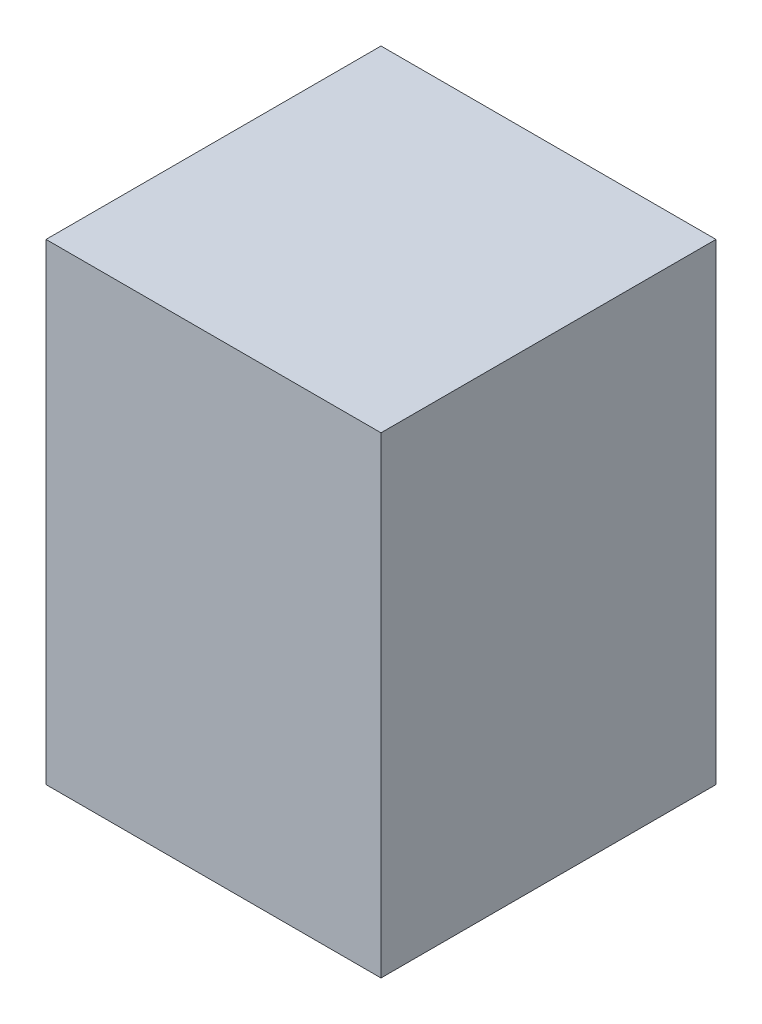
ISO-10303-21;
HEADER;
FILE_DESCRIPTION(('STEP AP214'),'2;1');
FILE_NAME('part.step','',(''),(''),'','','');
FILE_SCHEMA(('AUTOMOTIVE_DESIGN { 1 0 10303 214 1 1 1 1 }'));
ENDSEC;
DATA;
#1=APPLICATION_CONTEXT('core data for automotive mechanical design processes');
#2=APPLICATION_PROTOCOL_DEFINITION('international standard','automotive_design',2000,#1);
#3=PRODUCT_CONTEXT('',#1,'mechanical');
#4=PRODUCT('Part','Part','',(#3));
#5=PRODUCT_RELATED_PRODUCT_CATEGORY('part','',(#4));
#6=PRODUCT_DEFINITION_FORMATION('','',#4);
#7=PRODUCT_DEFINITION_CONTEXT('part definition',#1,'design');
#8=PRODUCT_DEFINITION('design','',#6,#7);
#9=PRODUCT_DEFINITION_SHAPE('','',#8);
#10=(LENGTH_UNIT() NAMED_UNIT(*) SI_UNIT(.MILLI.,.METRE.));
#11=(NAMED_UNIT(*) PLANE_ANGLE_UNIT() SI_UNIT($,.RADIAN.));
#12=(NAMED_UNIT(*) SI_UNIT($,.STERADIAN.) SOLID_ANGLE_UNIT());
#13=UNCERTAINTY_MEASURE_WITH_UNIT(LENGTH_MEASURE(1.E-05),#10,'distance_accuracy_value','');
#14=(GEOMETRIC_REPRESENTATION_CONTEXT(3) GLOBAL_UNCERTAINTY_ASSIGNED_CONTEXT((#13)) GLOBAL_UNIT_ASSIGNED_CONTEXT((#10,
#11,#12)) REPRESENTATION_CONTEXT('',''));
#15=CARTESIAN_POINT('',(0.,0.,0.));
#16=DIRECTION('',(0.,0.,1.));
#17=DIRECTION('',(1.,0.,0.));
#18=AXIS2_PLACEMENT_3D('',#15,#16,#17);
#19=CARTESIAN_POINT('',(0.,14.8,0.));
#20=DIRECTION('',(1.,0.,0.));
#21=DIRECTION('',(0.,0.,-1.));
#22=AXIS2_PLACEMENT_3D('',#19,#20,#21);
#23=PLANE('',#22);
#24=DIRECTION('',(0.,0.,1.));
#25=VECTOR('',#24,1.);
#26=CARTESIAN_POINT('',(0.,0.,0.));
#27=LINE('',#26,#25);
#28=CARTESIAN_POINT('',(0.,0.,-10.5));
#29=VERTEX_POINT('',#28);
#30=CARTESIAN_POINT('',(0.,0.,0.));
#31=VERTEX_POINT('',#30);
#32=EDGE_CURVE('E94',#29,#31,#27,.T.);
#33=ORIENTED_EDGE('',*,*,#32,.T.);
#34=DIRECTION('',(0.,-1.,0.));
#35=VECTOR('',#34,1.);
#36=CARTESIAN_POINT('',(0.,14.8,0.));
#37=LINE('',#36,#35);
#38=CARTESIAN_POINT('',(0.,14.8,0.));
#39=VERTEX_POINT('',#38);
#40=EDGE_CURVE('E11',#39,#31,#37,.T.);
#41=ORIENTED_EDGE('',*,*,#40,.F.);
#42=DIRECTION('',(0.,0.,1.));
#43=VECTOR('',#42,1.);
#44=CARTESIAN_POINT('',(0.,14.8,0.));
#45=LINE('',#44,#43);
#46=CARTESIAN_POINT('',(0.,14.8,-10.5));
#47=VERTEX_POINT('',#46);
#48=EDGE_CURVE('E82',#47,#39,#45,.T.);
#49=ORIENTED_EDGE('',*,*,#48,.F.);
#50=DIRECTION('',(0.,-1.,0.));
#51=VECTOR('',#50,1.);
#52=CARTESIAN_POINT('',(0.,14.8,-10.5));
#53=LINE('',#52,#51);
#54=EDGE_CURVE('E90',#47,#29,#53,.T.);
#55=ORIENTED_EDGE('',*,*,#54,.T.);
#56=EDGE_LOOP('',(#33,#41,#49,#55));
#57=FACE_BOUND('',#56,.T.);
#58=ADVANCED_FACE('F31',(#57),#23,.F.);
#59=CARTESIAN_POINT('',(0.,14.8,0.));
#60=DIRECTION('',(0.,0.,-1.));
#61=DIRECTION('',(-1.,0.,0.));
#62=AXIS2_PLACEMENT_3D('',#59,#60,#61);
#63=PLANE('',#62);
#64=DIRECTION('',(1.,0.,0.));
#65=VECTOR('',#64,1.);
#66=CARTESIAN_POINT('',(0.,0.,0.));
#67=LINE('',#66,#65);
#68=CARTESIAN_POINT('',(10.5,0.,0.));
#69=VERTEX_POINT('',#68);
#70=EDGE_CURVE('E86',#31,#69,#67,.T.);
#71=ORIENTED_EDGE('',*,*,#70,.T.);
#72=DIRECTION('',(0.,-1.,0.));
#73=VECTOR('',#72,1.);
#74=CARTESIAN_POINT('',(10.5,14.8,0.));
#75=LINE('',#74,#73);
#76=CARTESIAN_POINT('',(10.5,14.8,0.));
#77=VERTEX_POINT('',#76);
#78=EDGE_CURVE('E39',#77,#69,#75,.T.);
#79=ORIENTED_EDGE('',*,*,#78,.F.);
#80=DIRECTION('',(1.,0.,0.));
#81=VECTOR('',#80,1.);
#82=CARTESIAN_POINT('',(0.,14.8,0.));
#83=LINE('',#82,#81);
#84=EDGE_CURVE('E77',#39,#77,#83,.T.);
#85=ORIENTED_EDGE('',*,*,#84,.F.);
#86=ORIENTED_EDGE('',*,*,#40,.T.);
#87=EDGE_LOOP('',(#71,#79,#85,#86));
#88=FACE_BOUND('',#87,.T.);
#89=ADVANCED_FACE('F85',(#88),#63,.F.);
#90=CARTESIAN_POINT('',(10.5,14.8,0.));
#91=DIRECTION('',(-1.,0.,0.));
#92=DIRECTION('',(0.,0.,1.));
#93=AXIS2_PLACEMENT_3D('',#90,#91,#92);
#94=PLANE('',#93);
#95=DIRECTION('',(0.,0.,-1.));
#96=VECTOR('',#95,1.);
#97=CARTESIAN_POINT('',(10.5,0.,0.));
#98=LINE('',#97,#96);
#99=CARTESIAN_POINT('',(10.5,0.,-10.5));
#100=VERTEX_POINT('',#99);
#101=EDGE_CURVE('E64',#69,#100,#98,.T.);
#102=ORIENTED_EDGE('',*,*,#101,.T.);
#103=DIRECTION('',(0.,-1.,0.));
#104=VECTOR('',#103,1.);
#105=CARTESIAN_POINT('',(10.5,14.8,-10.5));
#106=LINE('',#105,#104);
#107=CARTESIAN_POINT('',(10.5,14.8,-10.5));
#108=VERTEX_POINT('',#107);
#109=EDGE_CURVE('E87',#108,#100,#106,.T.);
#110=ORIENTED_EDGE('',*,*,#109,.F.);
#111=DIRECTION('',(0.,0.,-1.));
#112=VECTOR('',#111,1.);
#113=CARTESIAN_POINT('',(10.5,14.8,0.));
#114=LINE('',#113,#112);
#115=EDGE_CURVE('E80',#77,#108,#114,.T.);
#116=ORIENTED_EDGE('',*,*,#115,.F.);
#117=ORIENTED_EDGE('',*,*,#78,.T.);
#118=EDGE_LOOP('',(#102,#110,#116,#117));
#119=FACE_BOUND('',#118,.T.);
#120=ADVANCED_FACE('F88',(#119),#94,.F.);
#121=CARTESIAN_POINT('',(0.,14.8,-10.5));
#122=DIRECTION('',(0.,0.,1.));
#123=DIRECTION('',(1.,0.,0.));
#124=AXIS2_PLACEMENT_3D('',#121,#122,#123);
#125=PLANE('',#124);
#126=DIRECTION('',(-1.,0.,0.));
#127=VECTOR('',#126,1.);
#128=CARTESIAN_POINT('',(0.,0.,-10.5));
#129=LINE('',#128,#127);
#130=EDGE_CURVE('E70',#100,#29,#129,.T.);
#131=ORIENTED_EDGE('',*,*,#130,.T.);
#132=ORIENTED_EDGE('',*,*,#54,.F.);
#133=DIRECTION('',(-1.,0.,0.));
#134=VECTOR('',#133,1.);
#135=CARTESIAN_POINT('',(0.,14.8,-10.5));
#136=LINE('',#135,#134);
#137=EDGE_CURVE('E47',#108,#47,#136,.T.);
#138=ORIENTED_EDGE('',*,*,#137,.F.);
#139=ORIENTED_EDGE('',*,*,#109,.T.);
#140=EDGE_LOOP('',(#131,#132,#138,#139));
#141=FACE_BOUND('',#140,.T.);
#142=ADVANCED_FACE('F101',(#141),#125,.F.);
#143=CARTESIAN_POINT('',(0.,14.8,-10.5));
#144=DIRECTION('',(0.,-1.,0.));
#145=DIRECTION('',(0.,0.,-1.));
#146=AXIS2_PLACEMENT_3D('',#143,#144,#145);
#147=PLANE('',#146);
#148=ORIENTED_EDGE('',*,*,#48,.T.);
#149=ORIENTED_EDGE('',*,*,#84,.T.);
#150=ORIENTED_EDGE('',*,*,#115,.T.);
#151=ORIENTED_EDGE('',*,*,#137,.T.);
#152=EDGE_LOOP('',(#148,#149,#150,#151));
#153=FACE_BOUND('',#152,.T.);
#154=ADVANCED_FACE('F78',(#153),#147,.F.);
#155=CARTESIAN_POINT('',(0.,0.,-10.5));
#156=DIRECTION('',(0.,-1.,0.));
#157=DIRECTION('',(0.,0.,-1.));
#158=AXIS2_PLACEMENT_3D('',#155,#156,#157);
#159=PLANE('',#158);
#160=ORIENTED_EDGE('',*,*,#32,.F.);
#161=ORIENTED_EDGE('',*,*,#130,.F.);
#162=ORIENTED_EDGE('',*,*,#101,.F.);
#163=ORIENTED_EDGE('',*,*,#70,.F.);
#164=EDGE_LOOP('',(#160,#161,#162,#163));
#165=FACE_BOUND('',#164,.T.);
#166=ADVANCED_FACE('F104',(#165),#159,.T.);
#167=CLOSED_SHELL('',(#58,#89,#120,#142,#154,#166));
#168=MANIFOLD_SOLID_BREP('B2',#167);
#169=ADVANCED_BREP_SHAPE_REPRESENTATION('',(#18,#168),#14);
#170=SHAPE_DEFINITION_REPRESENTATION(#9,#169);
ENDSEC;
END-ISO-10303-21;
